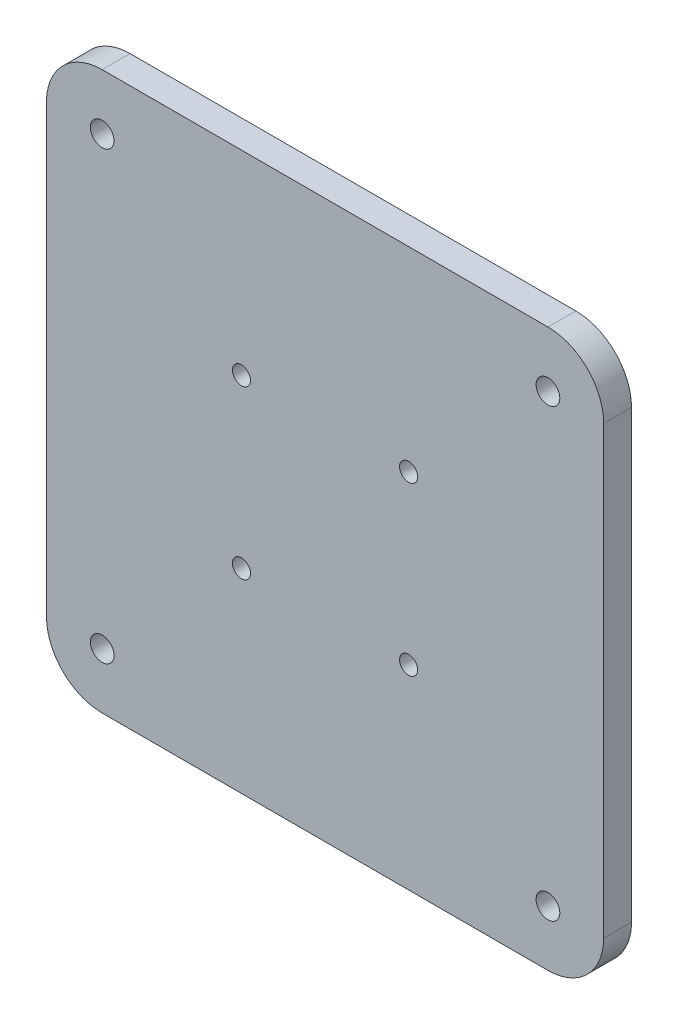
ISO-10303-21;
HEADER;
FILE_DESCRIPTION(('STEP AP214'),'2;1');
FILE_NAME('part.step','',(''),(''),'','','');
FILE_SCHEMA(('AUTOMOTIVE_DESIGN { 1 0 10303 214 1 1 1 1 }'));
ENDSEC;
DATA;
#1=APPLICATION_CONTEXT('core data for automotive mechanical design processes');
#2=APPLICATION_PROTOCOL_DEFINITION('international standard','automotive_design',2000,#1);
#3=PRODUCT_CONTEXT('',#1,'mechanical');
#4=PRODUCT('Part','Part','',(#3));
#5=PRODUCT_RELATED_PRODUCT_CATEGORY('part','',(#4));
#6=PRODUCT_DEFINITION_FORMATION('','',#4);
#7=PRODUCT_DEFINITION_CONTEXT('part definition',#1,'design');
#8=PRODUCT_DEFINITION('design','',#6,#7);
#9=PRODUCT_DEFINITION_SHAPE('','',#8);
#10=(LENGTH_UNIT() NAMED_UNIT(*) SI_UNIT(.MILLI.,.METRE.));
#11=(NAMED_UNIT(*) PLANE_ANGLE_UNIT() SI_UNIT($,.RADIAN.));
#12=(NAMED_UNIT(*) SI_UNIT($,.STERADIAN.) SOLID_ANGLE_UNIT());
#13=UNCERTAINTY_MEASURE_WITH_UNIT(LENGTH_MEASURE(1.E-05),#10,'distance_accuracy_value','');
#14=(GEOMETRIC_REPRESENTATION_CONTEXT(3) GLOBAL_UNCERTAINTY_ASSIGNED_CONTEXT((#13)) GLOBAL_UNIT_ASSIGNED_CONTEXT((#10,
#11,#12)) REPRESENTATION_CONTEXT('',''));
#15=CARTESIAN_POINT('',(0.,0.,0.));
#16=DIRECTION('',(0.,0.,1.));
#17=DIRECTION('',(1.,0.,0.));
#18=AXIS2_PLACEMENT_3D('',#15,#16,#17);
#19=CARTESIAN_POINT('',(0.,0.,10.));
#20=DIRECTION('',(0.,0.,-1.));
#21=DIRECTION('',(-1.,0.,0.));
#22=AXIS2_PLACEMENT_3D('',#19,#20,#21);
#23=PLANE('',#22);
#24=CARTESIAN_POINT('',(-80.,80.,10.));
#25=DIRECTION('',(0.,0.,-1.));
#26=DIRECTION('',(-1.,0.,0.));
#27=AXIS2_PLACEMENT_3D('',#24,#25,#26);
#28=CIRCLE('',#27,4.25000000000001);
#29=CARTESIAN_POINT('',(-84.25,80.,10.));
#30=VERTEX_POINT('',#29);
#31=EDGE_CURVE('E335',#30,#30,#28,.T.);
#32=ORIENTED_EDGE('',*,*,#31,.T.);
#33=EDGE_LOOP('',(#32));
#34=FACE_BOUND('',#33,.T.);
#35=CARTESIAN_POINT('',(80.,-80.,10.));
#36=DIRECTION('',(0.,0.,-1.));
#37=DIRECTION('',(-1.,0.,0.));
#38=AXIS2_PLACEMENT_3D('',#35,#36,#37);
#39=CIRCLE('',#38,4.25000000000001);
#40=CARTESIAN_POINT('',(75.75,-80.,10.));
#41=VERTEX_POINT('',#40);
#42=EDGE_CURVE('E323',#41,#41,#39,.T.);
#43=ORIENTED_EDGE('',*,*,#42,.T.);
#44=EDGE_LOOP('',(#43));
#45=FACE_BOUND('',#44,.T.);
#46=CARTESIAN_POINT('',(-30.,30.,10.));
#47=DIRECTION('',(0.,0.,-1.));
#48=DIRECTION('',(-1.,0.,0.));
#49=AXIS2_PLACEMENT_3D('',#46,#47,#48);
#50=CIRCLE('',#49,3.25000000000001);
#51=CARTESIAN_POINT('',(-33.25,30.,10.));
#52=VERTEX_POINT('',#51);
#53=EDGE_CURVE('E311',#52,#52,#50,.T.);
#54=ORIENTED_EDGE('',*,*,#53,.T.);
#55=EDGE_LOOP('',(#54));
#56=FACE_BOUND('',#55,.T.);
#57=CARTESIAN_POINT('',(30.,-30.,10.));
#58=DIRECTION('',(0.,0.,-1.));
#59=DIRECTION('',(-1.,0.,0.));
#60=AXIS2_PLACEMENT_3D('',#57,#58,#59);
#61=CIRCLE('',#60,3.25000000000001);
#62=CARTESIAN_POINT('',(26.75,-30.,10.));
#63=VERTEX_POINT('',#62);
#64=EDGE_CURVE('E299',#63,#63,#61,.T.);
#65=ORIENTED_EDGE('',*,*,#64,.T.);
#66=EDGE_LOOP('',(#65));
#67=FACE_BOUND('',#66,.T.);
#68=DIRECTION('',(1.,0.,0.));
#69=VECTOR('',#68,1.);
#70=CARTESIAN_POINT('',(-100.,100.,10.));
#71=LINE('',#70,#69);
#72=CARTESIAN_POINT('',(-80.,100.,10.));
#73=VERTEX_POINT('',#72);
#74=CARTESIAN_POINT('',(80.,100.,10.));
#75=VERTEX_POINT('',#74);
#76=EDGE_CURVE('E249',#73,#75,#71,.T.);
#77=ORIENTED_EDGE('',*,*,#76,.F.);
#78=CARTESIAN_POINT('',(-80.,80.,10.));
#79=DIRECTION('',(0.,0.,-1.));
#80=DIRECTION('',(-1.,0.,0.));
#81=AXIS2_PLACEMENT_3D('',#78,#79,#80);
#82=CIRCLE('',#81,20.);
#83=CARTESIAN_POINT('',(-100.,80.,10.));
#84=VERTEX_POINT('',#83);
#85=EDGE_CURVE('E273',#73,#84,#82,.F.);
#86=ORIENTED_EDGE('',*,*,#85,.T.);
#87=DIRECTION('',(0.,-1.,0.));
#88=VECTOR('',#87,1.);
#89=CARTESIAN_POINT('',(-100.,100.,10.));
#90=LINE('',#89,#88);
#91=CARTESIAN_POINT('',(-100.,-80.,10.));
#92=VERTEX_POINT('',#91);
#93=EDGE_CURVE('E242',#84,#92,#90,.T.);
#94=ORIENTED_EDGE('',*,*,#93,.T.);
#95=CARTESIAN_POINT('',(-80.,-80.,10.));
#96=DIRECTION('',(0.,0.,-1.));
#97=DIRECTION('',(-1.,0.,0.));
#98=AXIS2_PLACEMENT_3D('',#95,#96,#97);
#99=CIRCLE('',#98,20.);
#100=CARTESIAN_POINT('',(-80.,-100.,10.));
#101=VERTEX_POINT('',#100);
#102=EDGE_CURVE('E271',#92,#101,#99,.F.);
#103=ORIENTED_EDGE('',*,*,#102,.T.);
#104=DIRECTION('',(1.,0.,0.));
#105=VECTOR('',#104,1.);
#106=CARTESIAN_POINT('',(-100.,-100.,10.));
#107=LINE('',#106,#105);
#108=CARTESIAN_POINT('',(80.,-100.,10.));
#109=VERTEX_POINT('',#108);
#110=EDGE_CURVE('E284',#101,#109,#107,.T.);
#111=ORIENTED_EDGE('',*,*,#110,.T.);
#112=CARTESIAN_POINT('',(80.,-80.,10.));
#113=DIRECTION('',(0.,0.,-1.));
#114=DIRECTION('',(-1.,0.,0.));
#115=AXIS2_PLACEMENT_3D('',#112,#113,#114);
#116=CIRCLE('',#115,20.);
#117=CARTESIAN_POINT('',(100.,-80.,10.));
#118=VERTEX_POINT('',#117);
#119=EDGE_CURVE('E171',#109,#118,#116,.F.);
#120=ORIENTED_EDGE('',*,*,#119,.T.);
#121=DIRECTION('',(0.,-1.,0.));
#122=VECTOR('',#121,1.);
#123=CARTESIAN_POINT('',(100.,100.,10.));
#124=LINE('',#123,#122);
#125=CARTESIAN_POINT('',(100.,80.,10.));
#126=VERTEX_POINT('',#125);
#127=EDGE_CURVE('E253',#126,#118,#124,.T.);
#128=ORIENTED_EDGE('',*,*,#127,.F.);
#129=CARTESIAN_POINT('',(80.,80.,10.));
#130=DIRECTION('',(0.,0.,-1.));
#131=DIRECTION('',(-1.,0.,0.));
#132=AXIS2_PLACEMENT_3D('',#129,#130,#131);
#133=CIRCLE('',#132,20.);
#134=EDGE_CURVE('E268',#126,#75,#133,.F.);
#135=ORIENTED_EDGE('',*,*,#134,.T.);
#136=EDGE_LOOP('',(#77,#86,#94,#103,#111,#120,#128,#135));
#137=FACE_BOUND('',#136,.T.);
#138=CARTESIAN_POINT('',(-30.,-30.,10.));
#139=DIRECTION('',(0.,0.,1.));
#140=DIRECTION('',(1.,0.,0.));
#141=AXIS2_PLACEMENT_3D('',#138,#139,#140);
#142=CIRCLE('',#141,3.25000000000001);
#143=CARTESIAN_POINT('',(-26.75,-30.,10.));
#144=VERTEX_POINT('',#143);
#145=EDGE_CURVE('E306',#144,#144,#142,.T.);
#146=ORIENTED_EDGE('',*,*,#145,.F.);
#147=EDGE_LOOP('',(#146));
#148=FACE_BOUND('',#147,.T.);
#149=CARTESIAN_POINT('',(30.,30.,10.));
#150=DIRECTION('',(0.,0.,1.));
#151=DIRECTION('',(1.,0.,0.));
#152=AXIS2_PLACEMENT_3D('',#149,#150,#151);
#153=CIRCLE('',#152,3.25000000000001);
#154=CARTESIAN_POINT('',(33.25,30.,10.));
#155=VERTEX_POINT('',#154);
#156=EDGE_CURVE('E317',#155,#155,#153,.T.);
#157=ORIENTED_EDGE('',*,*,#156,.F.);
#158=EDGE_LOOP('',(#157));
#159=FACE_BOUND('',#158,.T.);
#160=CARTESIAN_POINT('',(-80.,-80.,10.));
#161=DIRECTION('',(0.,0.,1.));
#162=DIRECTION('',(1.,0.,0.));
#163=AXIS2_PLACEMENT_3D('',#160,#161,#162);
#164=CIRCLE('',#163,4.25000000000001);
#165=CARTESIAN_POINT('',(-75.75,-80.,10.));
#166=VERTEX_POINT('',#165);
#167=EDGE_CURVE('E329',#166,#166,#164,.T.);
#168=ORIENTED_EDGE('',*,*,#167,.F.);
#169=EDGE_LOOP('',(#168));
#170=FACE_BOUND('',#169,.T.);
#171=CARTESIAN_POINT('',(80.,80.,10.));
#172=DIRECTION('',(0.,0.,1.));
#173=DIRECTION('',(1.,0.,0.));
#174=AXIS2_PLACEMENT_3D('',#171,#172,#173);
#175=CIRCLE('',#174,4.25000000000001);
#176=CARTESIAN_POINT('',(84.25,80.,10.));
#177=VERTEX_POINT('',#176);
#178=EDGE_CURVE('E341',#177,#177,#175,.T.);
#179=ORIENTED_EDGE('',*,*,#178,.F.);
#180=EDGE_LOOP('',(#179));
#181=FACE_BOUND('',#180,.T.);
#182=ADVANCED_FACE('F156',(#34,#45,#56,#67,#137,#148,#159,#170,#181),#23,.F.);
#183=CARTESIAN_POINT('',(0.,0.,0.));
#184=DIRECTION('',(0.,0.,-1.));
#185=DIRECTION('',(-1.,0.,0.));
#186=AXIS2_PLACEMENT_3D('',#183,#184,#185);
#187=PLANE('',#186);
#188=CARTESIAN_POINT('',(-80.,-80.,0.));
#189=DIRECTION('',(0.,0.,1.));
#190=DIRECTION('',(1.,0.,0.));
#191=AXIS2_PLACEMENT_3D('',#188,#189,#190);
#192=CIRCLE('',#191,4.25000000000001);
#193=CARTESIAN_POINT('',(-75.75,-80.,0.));
#194=VERTEX_POINT('',#193);
#195=EDGE_CURVE('E332',#194,#194,#192,.T.);
#196=ORIENTED_EDGE('',*,*,#195,.T.);
#197=EDGE_LOOP('',(#196));
#198=FACE_BOUND('',#197,.T.);
#199=CARTESIAN_POINT('',(80.,-80.,0.));
#200=DIRECTION('',(0.,0.,-1.));
#201=DIRECTION('',(-1.,0.,0.));
#202=AXIS2_PLACEMENT_3D('',#199,#200,#201);
#203=CIRCLE('',#202,4.25000000000001);
#204=CARTESIAN_POINT('',(75.75,-80.,0.));
#205=VERTEX_POINT('',#204);
#206=EDGE_CURVE('E326',#205,#205,#203,.T.);
#207=ORIENTED_EDGE('',*,*,#206,.F.);
#208=EDGE_LOOP('',(#207));
#209=FACE_BOUND('',#208,.T.);
#210=CARTESIAN_POINT('',(-30.,-30.,0.));
#211=DIRECTION('',(0.,0.,1.));
#212=DIRECTION('',(1.,0.,0.));
#213=AXIS2_PLACEMENT_3D('',#210,#211,#212);
#214=CIRCLE('',#213,3.25000000000001);
#215=CARTESIAN_POINT('',(-26.75,-30.,0.));
#216=VERTEX_POINT('',#215);
#217=EDGE_CURVE('E308',#216,#216,#214,.T.);
#218=ORIENTED_EDGE('',*,*,#217,.T.);
#219=EDGE_LOOP('',(#218));
#220=FACE_BOUND('',#219,.T.);
#221=CARTESIAN_POINT('',(30.,-30.,0.));
#222=DIRECTION('',(0.,0.,-1.));
#223=DIRECTION('',(-1.,0.,0.));
#224=AXIS2_PLACEMENT_3D('',#221,#222,#223);
#225=CIRCLE('',#224,3.25000000000001);
#226=CARTESIAN_POINT('',(26.75,-30.,0.));
#227=VERTEX_POINT('',#226);
#228=EDGE_CURVE('E301',#227,#227,#225,.T.);
#229=ORIENTED_EDGE('',*,*,#228,.F.);
#230=EDGE_LOOP('',(#229));
#231=FACE_BOUND('',#230,.T.);
#232=DIRECTION('',(0.,-1.,0.));
#233=VECTOR('',#232,1.);
#234=CARTESIAN_POINT('',(-100.,100.,0.));
#235=LINE('',#234,#233);
#236=CARTESIAN_POINT('',(-100.,80.,0.));
#237=VERTEX_POINT('',#236);
#238=CARTESIAN_POINT('',(-100.,-80.,0.));
#239=VERTEX_POINT('',#238);
#240=EDGE_CURVE('E239',#237,#239,#235,.T.);
#241=ORIENTED_EDGE('',*,*,#240,.F.);
#242=CARTESIAN_POINT('',(-80.,80.,0.));
#243=DIRECTION('',(0.,0.,-1.));
#244=DIRECTION('',(-1.,0.,0.));
#245=AXIS2_PLACEMENT_3D('',#242,#243,#244);
#246=CIRCLE('',#245,20.);
#247=CARTESIAN_POINT('',(-80.,100.,0.));
#248=VERTEX_POINT('',#247);
#249=EDGE_CURVE('E222',#237,#248,#246,.T.);
#250=ORIENTED_EDGE('',*,*,#249,.T.);
#251=DIRECTION('',(1.,0.,0.));
#252=VECTOR('',#251,1.);
#253=CARTESIAN_POINT('',(-100.,100.,0.));
#254=LINE('',#253,#252);
#255=CARTESIAN_POINT('',(80.,100.,0.));
#256=VERTEX_POINT('',#255);
#257=EDGE_CURVE('E298',#248,#256,#254,.T.);
#258=ORIENTED_EDGE('',*,*,#257,.T.);
#259=CARTESIAN_POINT('',(80.,80.,0.));
#260=DIRECTION('',(0.,0.,-1.));
#261=DIRECTION('',(-1.,0.,0.));
#262=AXIS2_PLACEMENT_3D('',#259,#260,#261);
#263=CIRCLE('',#262,20.);
#264=CARTESIAN_POINT('',(100.,80.,0.));
#265=VERTEX_POINT('',#264);
#266=EDGE_CURVE('E243',#256,#265,#263,.T.);
#267=ORIENTED_EDGE('',*,*,#266,.T.);
#268=DIRECTION('',(0.,-1.,0.));
#269=VECTOR('',#268,1.);
#270=CARTESIAN_POINT('',(100.,100.,0.));
#271=LINE('',#270,#269);
#272=CARTESIAN_POINT('',(100.,-80.,0.));
#273=VERTEX_POINT('',#272);
#274=EDGE_CURVE('E256',#265,#273,#271,.T.);
#275=ORIENTED_EDGE('',*,*,#274,.T.);
#276=CARTESIAN_POINT('',(80.,-80.,0.));
#277=DIRECTION('',(0.,0.,-1.));
#278=DIRECTION('',(-1.,0.,0.));
#279=AXIS2_PLACEMENT_3D('',#276,#277,#278);
#280=CIRCLE('',#279,20.);
#281=CARTESIAN_POINT('',(80.,-100.,0.));
#282=VERTEX_POINT('',#281);
#283=EDGE_CURVE('E262',#273,#282,#280,.T.);
#284=ORIENTED_EDGE('',*,*,#283,.T.);
#285=DIRECTION('',(1.,0.,0.));
#286=VECTOR('',#285,1.);
#287=CARTESIAN_POINT('',(-100.,-100.,0.));
#288=LINE('',#287,#286);
#289=CARTESIAN_POINT('',(-80.,-100.,0.));
#290=VERTEX_POINT('',#289);
#291=EDGE_CURVE('E250',#290,#282,#288,.T.);
#292=ORIENTED_EDGE('',*,*,#291,.F.);
#293=CARTESIAN_POINT('',(-80.,-80.,0.));
#294=DIRECTION('',(0.,0.,-1.));
#295=DIRECTION('',(-1.,0.,0.));
#296=AXIS2_PLACEMENT_3D('',#293,#294,#295);
#297=CIRCLE('',#296,20.);
#298=EDGE_CURVE('E233',#290,#239,#297,.T.);
#299=ORIENTED_EDGE('',*,*,#298,.T.);
#300=EDGE_LOOP('',(#241,#250,#258,#267,#275,#284,#292,#299));
#301=FACE_BOUND('',#300,.T.);
#302=CARTESIAN_POINT('',(-30.,30.,0.));
#303=DIRECTION('',(0.,0.,-1.));
#304=DIRECTION('',(-1.,0.,0.));
#305=AXIS2_PLACEMENT_3D('',#302,#303,#304);
#306=CIRCLE('',#305,3.25000000000001);
#307=CARTESIAN_POINT('',(-33.25,30.,0.));
#308=VERTEX_POINT('',#307);
#309=EDGE_CURVE('E314',#308,#308,#306,.T.);
#310=ORIENTED_EDGE('',*,*,#309,.F.);
#311=EDGE_LOOP('',(#310));
#312=FACE_BOUND('',#311,.T.);
#313=CARTESIAN_POINT('',(30.,30.,0.));
#314=DIRECTION('',(0.,0.,1.));
#315=DIRECTION('',(1.,0.,0.));
#316=AXIS2_PLACEMENT_3D('',#313,#314,#315);
#317=CIRCLE('',#316,3.25000000000001);
#318=CARTESIAN_POINT('',(33.25,30.,0.));
#319=VERTEX_POINT('',#318);
#320=EDGE_CURVE('E320',#319,#319,#317,.T.);
#321=ORIENTED_EDGE('',*,*,#320,.T.);
#322=EDGE_LOOP('',(#321));
#323=FACE_BOUND('',#322,.T.);
#324=CARTESIAN_POINT('',(-80.,80.,0.));
#325=DIRECTION('',(0.,0.,-1.));
#326=DIRECTION('',(-1.,0.,0.));
#327=AXIS2_PLACEMENT_3D('',#324,#325,#326);
#328=CIRCLE('',#327,4.25000000000001);
#329=CARTESIAN_POINT('',(-84.25,80.,0.));
#330=VERTEX_POINT('',#329);
#331=EDGE_CURVE('E338',#330,#330,#328,.T.);
#332=ORIENTED_EDGE('',*,*,#331,.F.);
#333=EDGE_LOOP('',(#332));
#334=FACE_BOUND('',#333,.T.);
#335=CARTESIAN_POINT('',(80.,80.,0.));
#336=DIRECTION('',(0.,0.,1.));
#337=DIRECTION('',(1.,0.,0.));
#338=AXIS2_PLACEMENT_3D('',#335,#336,#337);
#339=CIRCLE('',#338,4.25000000000001);
#340=CARTESIAN_POINT('',(84.25,80.,0.));
#341=VERTEX_POINT('',#340);
#342=EDGE_CURVE('E344',#341,#341,#339,.T.);
#343=ORIENTED_EDGE('',*,*,#342,.T.);
#344=EDGE_LOOP('',(#343));
#345=FACE_BOUND('',#344,.T.);
#346=ADVANCED_FACE('F246',(#198,#209,#220,#231,#301,#312,#323,#334,#345),#187,.T.);
#347=CARTESIAN_POINT('',(-100.,100.,10.));
#348=DIRECTION('',(0.,1.,0.));
#349=DIRECTION('',(0.,0.,1.));
#350=AXIS2_PLACEMENT_3D('',#347,#348,#349);
#351=PLANE('',#350);
#352=ORIENTED_EDGE('',*,*,#257,.F.);
#353=DIRECTION('',(0.,0.,-1.));
#354=VECTOR('',#353,1.);
#355=CARTESIAN_POINT('',(-80.,100.,10.));
#356=LINE('',#355,#354);
#357=EDGE_CURVE('E227',#248,#73,#356,.F.);
#358=ORIENTED_EDGE('',*,*,#357,.T.);
#359=ORIENTED_EDGE('',*,*,#76,.T.);
#360=DIRECTION('',(0.,0.,-1.));
#361=VECTOR('',#360,1.);
#362=CARTESIAN_POINT('',(80.,100.,10.));
#363=LINE('',#362,#361);
#364=EDGE_CURVE('E232',#75,#256,#363,.T.);
#365=ORIENTED_EDGE('',*,*,#364,.T.);
#366=EDGE_LOOP('',(#352,#358,#359,#365));
#367=FACE_BOUND('',#366,.T.);
#368=ADVANCED_FACE('F359',(#367),#351,.T.);
#369=CARTESIAN_POINT('',(-100.,100.,10.));
#370=DIRECTION('',(1.,0.,0.));
#371=DIRECTION('',(0.,1.,0.));
#372=AXIS2_PLACEMENT_3D('',#369,#370,#371);
#373=PLANE('',#372);
#374=ORIENTED_EDGE('',*,*,#93,.F.);
#375=DIRECTION('',(0.,0.,-1.));
#376=VECTOR('',#375,1.);
#377=CARTESIAN_POINT('',(-100.,80.,0.));
#378=LINE('',#377,#376);
#379=EDGE_CURVE('E226',#84,#237,#378,.T.);
#380=ORIENTED_EDGE('',*,*,#379,.T.);
#381=ORIENTED_EDGE('',*,*,#240,.T.);
#382=DIRECTION('',(0.,0.,-1.));
#383=VECTOR('',#382,1.);
#384=CARTESIAN_POINT('',(-100.,-80.,10.));
#385=LINE('',#384,#383);
#386=EDGE_CURVE('E244',#239,#92,#385,.F.);
#387=ORIENTED_EDGE('',*,*,#386,.T.);
#388=EDGE_LOOP('',(#374,#380,#381,#387));
#389=FACE_BOUND('',#388,.T.);
#390=ADVANCED_FACE('F238',(#389),#373,.F.);
#391=CARTESIAN_POINT('',(-100.,-100.,10.));
#392=DIRECTION('',(0.,1.,0.));
#393=DIRECTION('',(0.,0.,1.));
#394=AXIS2_PLACEMENT_3D('',#391,#392,#393);
#395=PLANE('',#394);
#396=ORIENTED_EDGE('',*,*,#110,.F.);
#397=DIRECTION('',(0.,0.,-1.));
#398=VECTOR('',#397,1.);
#399=CARTESIAN_POINT('',(-80.,-100.,10.));
#400=LINE('',#399,#398);
#401=EDGE_CURVE('E277',#101,#290,#400,.T.);
#402=ORIENTED_EDGE('',*,*,#401,.T.);
#403=ORIENTED_EDGE('',*,*,#291,.T.);
#404=DIRECTION('',(0.,0.,-1.));
#405=VECTOR('',#404,1.);
#406=CARTESIAN_POINT('',(80.,-100.,10.));
#407=LINE('',#406,#405);
#408=EDGE_CURVE('E275',#282,#109,#407,.F.);
#409=ORIENTED_EDGE('',*,*,#408,.T.);
#410=EDGE_LOOP('',(#396,#402,#403,#409));
#411=FACE_BOUND('',#410,.T.);
#412=ADVANCED_FACE('F282',(#411),#395,.F.);
#413=CARTESIAN_POINT('',(100.,100.,10.));
#414=DIRECTION('',(1.,0.,0.));
#415=DIRECTION('',(0.,1.,0.));
#416=AXIS2_PLACEMENT_3D('',#413,#414,#415);
#417=PLANE('',#416);
#418=ORIENTED_EDGE('',*,*,#127,.T.);
#419=DIRECTION('',(0.,0.,-1.));
#420=VECTOR('',#419,1.);
#421=CARTESIAN_POINT('',(100.,-80.,0.));
#422=LINE('',#421,#420);
#423=EDGE_CURVE('E12',#118,#273,#422,.T.);
#424=ORIENTED_EDGE('',*,*,#423,.T.);
#425=ORIENTED_EDGE('',*,*,#274,.F.);
#426=DIRECTION('',(0.,0.,-1.));
#427=VECTOR('',#426,1.);
#428=CARTESIAN_POINT('',(100.,80.,10.));
#429=LINE('',#428,#427);
#430=EDGE_CURVE('E164',#265,#126,#429,.F.);
#431=ORIENTED_EDGE('',*,*,#430,.T.);
#432=EDGE_LOOP('',(#418,#424,#425,#431));
#433=FACE_BOUND('',#432,.T.);
#434=ADVANCED_FACE('F291',(#433),#417,.T.);
#435=CARTESIAN_POINT('',(30.,-30.,10.));
#436=DIRECTION('',(0.,0.,-1.));
#437=DIRECTION('',(-1.,0.,0.));
#438=AXIS2_PLACEMENT_3D('',#435,#436,#437);
#439=CYLINDRICAL_SURFACE('',#438,3.25000000000001);
#440=ORIENTED_EDGE('',*,*,#64,.F.);
#441=EDGE_LOOP('',(#440));
#442=FACE_BOUND('',#441,.T.);
#443=ORIENTED_EDGE('',*,*,#228,.T.);
#444=EDGE_LOOP('',(#443));
#445=FACE_BOUND('',#444,.T.);
#446=ADVANCED_FACE('F364',(#442,#445),#439,.F.);
#447=CARTESIAN_POINT('',(-30.,-30.,10.));
#448=DIRECTION('',(0.,0.,-1.));
#449=DIRECTION('',(-1.,0.,0.));
#450=AXIS2_PLACEMENT_3D('',#447,#448,#449);
#451=CYLINDRICAL_SURFACE('',#450,3.25000000000001);
#452=ORIENTED_EDGE('',*,*,#145,.T.);
#453=EDGE_LOOP('',(#452));
#454=FACE_BOUND('',#453,.T.);
#455=ORIENTED_EDGE('',*,*,#217,.F.);
#456=EDGE_LOOP('',(#455));
#457=FACE_BOUND('',#456,.T.);
#458=ADVANCED_FACE('F411',(#454,#457),#451,.F.);
#459=CARTESIAN_POINT('',(-30.,30.,10.));
#460=DIRECTION('',(0.,0.,-1.));
#461=DIRECTION('',(-1.,0.,0.));
#462=AXIS2_PLACEMENT_3D('',#459,#460,#461);
#463=CYLINDRICAL_SURFACE('',#462,3.25000000000001);
#464=ORIENTED_EDGE('',*,*,#53,.F.);
#465=EDGE_LOOP('',(#464));
#466=FACE_BOUND('',#465,.T.);
#467=ORIENTED_EDGE('',*,*,#309,.T.);
#468=EDGE_LOOP('',(#467));
#469=FACE_BOUND('',#468,.T.);
#470=ADVANCED_FACE('F416',(#466,#469),#463,.F.);
#471=CARTESIAN_POINT('',(30.,30.,10.));
#472=DIRECTION('',(0.,0.,-1.));
#473=DIRECTION('',(-1.,0.,0.));
#474=AXIS2_PLACEMENT_3D('',#471,#472,#473);
#475=CYLINDRICAL_SURFACE('',#474,3.25000000000001);
#476=ORIENTED_EDGE('',*,*,#156,.T.);
#477=EDGE_LOOP('',(#476));
#478=FACE_BOUND('',#477,.T.);
#479=ORIENTED_EDGE('',*,*,#320,.F.);
#480=EDGE_LOOP('',(#479));
#481=FACE_BOUND('',#480,.T.);
#482=ADVANCED_FACE('F421',(#478,#481),#475,.F.);
#483=CARTESIAN_POINT('',(80.,-80.,10.));
#484=DIRECTION('',(0.,0.,-1.));
#485=DIRECTION('',(-1.,0.,0.));
#486=AXIS2_PLACEMENT_3D('',#483,#484,#485);
#487=CYLINDRICAL_SURFACE('',#486,4.25000000000001);
#488=ORIENTED_EDGE('',*,*,#42,.F.);
#489=EDGE_LOOP('',(#488));
#490=FACE_BOUND('',#489,.T.);
#491=ORIENTED_EDGE('',*,*,#206,.T.);
#492=EDGE_LOOP('',(#491));
#493=FACE_BOUND('',#492,.T.);
#494=ADVANCED_FACE('F400',(#490,#493),#487,.F.);
#495=CARTESIAN_POINT('',(-80.,-80.,10.));
#496=DIRECTION('',(0.,0.,-1.));
#497=DIRECTION('',(-1.,0.,0.));
#498=AXIS2_PLACEMENT_3D('',#495,#496,#497);
#499=CYLINDRICAL_SURFACE('',#498,4.25000000000001);
#500=ORIENTED_EDGE('',*,*,#167,.T.);
#501=EDGE_LOOP('',(#500));
#502=FACE_BOUND('',#501,.T.);
#503=ORIENTED_EDGE('',*,*,#195,.F.);
#504=EDGE_LOOP('',(#503));
#505=FACE_BOUND('',#504,.T.);
#506=ADVANCED_FACE('F396',(#502,#505),#499,.F.);
#507=CARTESIAN_POINT('',(-80.,80.,10.));
#508=DIRECTION('',(0.,0.,-1.));
#509=DIRECTION('',(-1.,0.,0.));
#510=AXIS2_PLACEMENT_3D('',#507,#508,#509);
#511=CYLINDRICAL_SURFACE('',#510,4.25000000000001);
#512=ORIENTED_EDGE('',*,*,#31,.F.);
#513=EDGE_LOOP('',(#512));
#514=FACE_BOUND('',#513,.T.);
#515=ORIENTED_EDGE('',*,*,#331,.T.);
#516=EDGE_LOOP('',(#515));
#517=FACE_BOUND('',#516,.T.);
#518=ADVANCED_FACE('F399',(#514,#517),#511,.F.);
#519=CARTESIAN_POINT('',(80.,80.,10.));
#520=DIRECTION('',(0.,0.,-1.));
#521=DIRECTION('',(-1.,0.,0.));
#522=AXIS2_PLACEMENT_3D('',#519,#520,#521);
#523=CYLINDRICAL_SURFACE('',#522,4.25000000000001);
#524=ORIENTED_EDGE('',*,*,#178,.T.);
#525=EDGE_LOOP('',(#524));
#526=FACE_BOUND('',#525,.T.);
#527=ORIENTED_EDGE('',*,*,#342,.F.);
#528=EDGE_LOOP('',(#527));
#529=FACE_BOUND('',#528,.T.);
#530=ADVANCED_FACE('F350',(#526,#529),#523,.F.);
#531=CARTESIAN_POINT('',(-80.,80.,10.));
#532=DIRECTION('',(0.,0.,1.));
#533=DIRECTION('',(1.,0.,0.));
#534=AXIS2_PLACEMENT_3D('',#531,#532,#533);
#535=CYLINDRICAL_SURFACE('',#534,20.);
#536=ORIENTED_EDGE('',*,*,#85,.F.);
#537=ORIENTED_EDGE('',*,*,#357,.F.);
#538=ORIENTED_EDGE('',*,*,#249,.F.);
#539=ORIENTED_EDGE('',*,*,#379,.F.);
#540=EDGE_LOOP('',(#536,#537,#538,#539));
#541=FACE_BOUND('',#540,.T.);
#542=ADVANCED_FACE('F225',(#541),#535,.T.);
#543=CARTESIAN_POINT('',(-80.,-80.,10.));
#544=DIRECTION('',(0.,0.,-1.));
#545=DIRECTION('',(-1.,0.,0.));
#546=AXIS2_PLACEMENT_3D('',#543,#544,#545);
#547=CYLINDRICAL_SURFACE('',#546,20.);
#548=ORIENTED_EDGE('',*,*,#102,.F.);
#549=ORIENTED_EDGE('',*,*,#386,.F.);
#550=ORIENTED_EDGE('',*,*,#298,.F.);
#551=ORIENTED_EDGE('',*,*,#401,.F.);
#552=EDGE_LOOP('',(#548,#549,#550,#551));
#553=FACE_BOUND('',#552,.T.);
#554=ADVANCED_FACE('F378',(#553),#547,.T.);
#555=CARTESIAN_POINT('',(80.,-80.,10.));
#556=DIRECTION('',(0.,0.,1.));
#557=DIRECTION('',(1.,0.,0.));
#558=AXIS2_PLACEMENT_3D('',#555,#556,#557);
#559=CYLINDRICAL_SURFACE('',#558,20.);
#560=ORIENTED_EDGE('',*,*,#119,.F.);
#561=ORIENTED_EDGE('',*,*,#408,.F.);
#562=ORIENTED_EDGE('',*,*,#283,.F.);
#563=ORIENTED_EDGE('',*,*,#423,.F.);
#564=EDGE_LOOP('',(#560,#561,#562,#563));
#565=FACE_BOUND('',#564,.T.);
#566=ADVANCED_FACE('F290',(#565),#559,.T.);
#567=CARTESIAN_POINT('',(80.,80.,10.));
#568=DIRECTION('',(0.,0.,-1.));
#569=DIRECTION('',(-1.,0.,0.));
#570=AXIS2_PLACEMENT_3D('',#567,#568,#569);
#571=CYLINDRICAL_SURFACE('',#570,20.);
#572=ORIENTED_EDGE('',*,*,#134,.F.);
#573=ORIENTED_EDGE('',*,*,#430,.F.);
#574=ORIENTED_EDGE('',*,*,#266,.F.);
#575=ORIENTED_EDGE('',*,*,#364,.F.);
#576=EDGE_LOOP('',(#572,#573,#574,#575));
#577=FACE_BOUND('',#576,.T.);
#578=ADVANCED_FACE('F158',(#577),#571,.T.);
#579=CLOSED_SHELL('',(#182,#346,#368,#390,#412,#434,#446,#458,#470,#482,#494,#506,#518,#530,
#542,#554,#566,#578));
#580=MANIFOLD_SOLID_BREP('B2',#579);
#581=ADVANCED_BREP_SHAPE_REPRESENTATION('',(#18,#580),#14);
#582=SHAPE_DEFINITION_REPRESENTATION(#9,#581);
ENDSEC;
END-ISO-10303-21;
